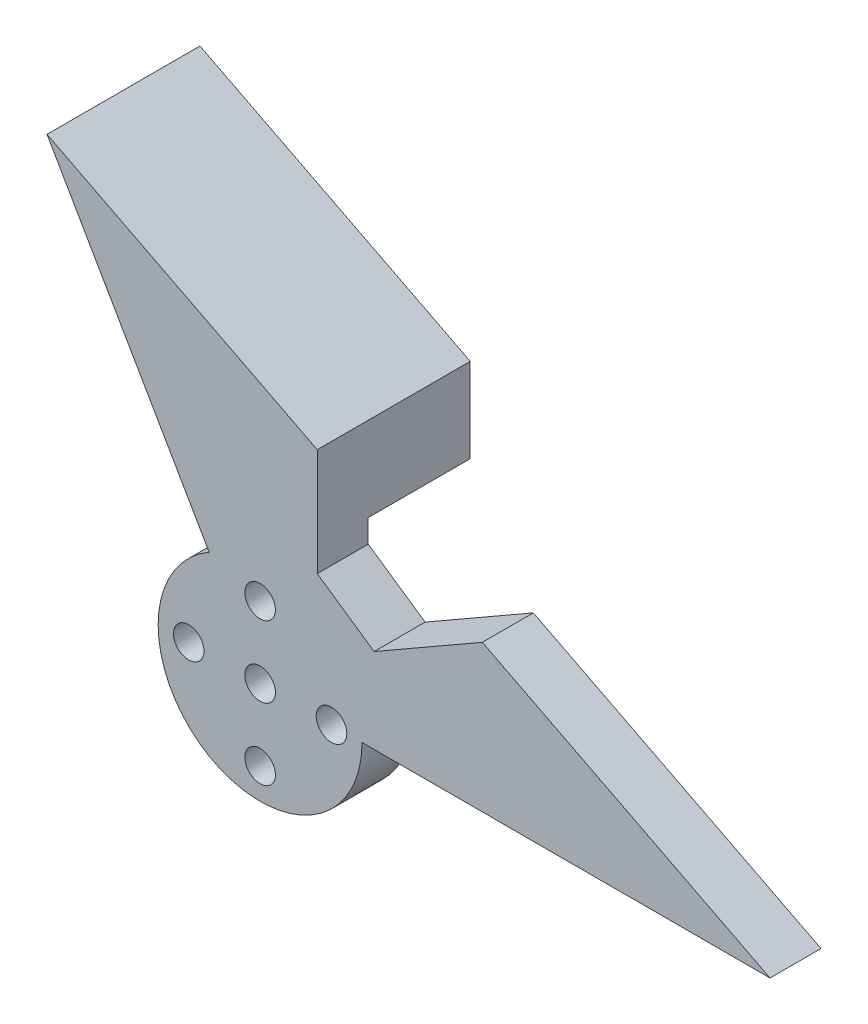
ISO-10303-21;
HEADER;
FILE_DESCRIPTION(('STEP AP214'),'2;1');
FILE_NAME('part.step','',(''),(''),'','','');
FILE_SCHEMA(('AUTOMOTIVE_DESIGN { 1 0 10303 214 1 1 1 1 }'));
ENDSEC;
DATA;
#1=APPLICATION_CONTEXT('core data for automotive mechanical design processes');
#2=APPLICATION_PROTOCOL_DEFINITION('international standard','automotive_design',2000,#1);
#3=PRODUCT_CONTEXT('',#1,'mechanical');
#4=PRODUCT('Part','Part','',(#3));
#5=PRODUCT_RELATED_PRODUCT_CATEGORY('part','',(#4));
#6=PRODUCT_DEFINITION_FORMATION('','',#4);
#7=PRODUCT_DEFINITION_CONTEXT('part definition',#1,'design');
#8=PRODUCT_DEFINITION('design','',#6,#7);
#9=PRODUCT_DEFINITION_SHAPE('','',#8);
#10=(LENGTH_UNIT() NAMED_UNIT(*) SI_UNIT(.MILLI.,.METRE.));
#11=(NAMED_UNIT(*) PLANE_ANGLE_UNIT() SI_UNIT($,.RADIAN.));
#12=(NAMED_UNIT(*) SI_UNIT($,.STERADIAN.) SOLID_ANGLE_UNIT());
#13=UNCERTAINTY_MEASURE_WITH_UNIT(LENGTH_MEASURE(1.E-05),#10,'distance_accuracy_value','');
#14=(GEOMETRIC_REPRESENTATION_CONTEXT(3) GLOBAL_UNCERTAINTY_ASSIGNED_CONTEXT((#13)) GLOBAL_UNIT_ASSIGNED_CONTEXT((#10,
#11,#12)) REPRESENTATION_CONTEXT('',''));
#15=CARTESIAN_POINT('',(0.,0.,0.));
#16=DIRECTION('',(0.,0.,1.));
#17=DIRECTION('',(1.,0.,0.));
#18=AXIS2_PLACEMENT_3D('',#15,#16,#17);
#19=CARTESIAN_POINT('',(0.,0.,0.));
#20=DIRECTION('',(0.,0.,1.));
#21=DIRECTION('',(1.,0.,0.));
#22=AXIS2_PLACEMENT_3D('',#19,#20,#21);
#23=PLANE('',#22);
#24=CARTESIAN_POINT('',(0.,0.,0.));
#25=DIRECTION('',(0.,0.,1.));
#26=DIRECTION('',(1.,0.,0.));
#27=AXIS2_PLACEMENT_3D('',#24,#25,#26);
#28=CIRCLE('',#27,1.5);
#29=CARTESIAN_POINT('',(1.5,0.,0.));
#30=VERTEX_POINT('',#29);
#31=EDGE_CURVE('E426',#30,#30,#28,.T.);
#32=ORIENTED_EDGE('',*,*,#31,.T.);
#33=EDGE_LOOP('',(#32));
#34=FACE_BOUND('',#33,.T.);
#35=CARTESIAN_POINT('',(0.,7.,0.));
#36=DIRECTION('',(0.,0.,1.));
#37=DIRECTION('',(1.,0.,0.));
#38=AXIS2_PLACEMENT_3D('',#35,#36,#37);
#39=CIRCLE('',#38,1.5);
#40=CARTESIAN_POINT('',(1.5,7.,0.));
#41=VERTEX_POINT('',#40);
#42=EDGE_CURVE('E460',#41,#41,#39,.T.);
#43=ORIENTED_EDGE('',*,*,#42,.T.);
#44=EDGE_LOOP('',(#43));
#45=FACE_BOUND('',#44,.T.);
#46=CARTESIAN_POINT('',(7.,0.,0.));
#47=DIRECTION('',(0.,0.,1.));
#48=DIRECTION('',(1.,0.,0.));
#49=AXIS2_PLACEMENT_3D('',#46,#47,#48);
#50=CIRCLE('',#49,1.5);
#51=CARTESIAN_POINT('',(8.5,0.,0.));
#52=VERTEX_POINT('',#51);
#53=EDGE_CURVE('E456',#52,#52,#50,.T.);
#54=ORIENTED_EDGE('',*,*,#53,.T.);
#55=EDGE_LOOP('',(#54));
#56=FACE_BOUND('',#55,.T.);
#57=CARTESIAN_POINT('',(0.,-7.,0.));
#58=DIRECTION('',(0.,0.,1.));
#59=DIRECTION('',(1.,0.,0.));
#60=AXIS2_PLACEMENT_3D('',#57,#58,#59);
#61=CIRCLE('',#60,1.5);
#62=CARTESIAN_POINT('',(1.5,-7.,0.));
#63=VERTEX_POINT('',#62);
#64=EDGE_CURVE('E452',#63,#63,#61,.T.);
#65=ORIENTED_EDGE('',*,*,#64,.T.);
#66=EDGE_LOOP('',(#65));
#67=FACE_BOUND('',#66,.T.);
#68=CARTESIAN_POINT('',(-7.,0.,0.));
#69=DIRECTION('',(0.,0.,1.));
#70=DIRECTION('',(1.,0.,0.));
#71=AXIS2_PLACEMENT_3D('',#68,#69,#70);
#72=CIRCLE('',#71,1.5);
#73=CARTESIAN_POINT('',(-5.5,0.,0.));
#74=VERTEX_POINT('',#73);
#75=EDGE_CURVE('E441',#74,#74,#72,.T.);
#76=ORIENTED_EDGE('',*,*,#75,.T.);
#77=EDGE_LOOP('',(#76));
#78=FACE_BOUND('',#77,.T.);
#79=DIRECTION('',(-0.948423761070831,-0.317005314523684,0.));
#80=VECTOR('',#79,1.);
#81=CARTESIAN_POINT('',(-3.76737876846068,11.2713300921487,0.));
#82=LINE('',#81,#80);
#83=CARTESIAN_POINT('',(5.60315487744621,14.403378325864,0.));
#84=VERTEX_POINT('',#83);
#85=CARTESIAN_POINT('',(-6.06426194190596,10.5036097937875,0.));
#86=VERTEX_POINT('',#85);
#87=EDGE_CURVE('E56',#84,#86,#82,.T.);
#88=ORIENTED_EDGE('',*,*,#87,.F.);
#89=DIRECTION('',(0.,-1.,0.));
#90=VECTOR('',#89,1.);
#91=CARTESIAN_POINT('',(5.60315487744621,25.2923778187747,0.));
#92=LINE('',#91,#90);
#93=CARTESIAN_POINT('',(5.60315487744621,12.1416789813155,0.));
#94=VERTEX_POINT('',#93);
#95=EDGE_CURVE('E142',#84,#94,#92,.T.);
#96=ORIENTED_EDGE('',*,*,#95,.T.);
#97=DIRECTION('',(0.824400775660672,-0.566006502692401,0.));
#98=VECTOR('',#97,1.);
#99=CARTESIAN_POINT('',(5.60315487744621,12.1416789813155,0.));
#100=LINE('',#99,#98);
#101=CARTESIAN_POINT('',(11.1797170426979,8.31299450965011,0.));
#102=VERTEX_POINT('',#101);
#103=EDGE_CURVE('E155',#94,#102,#100,.T.);
#104=ORIENTED_EDGE('',*,*,#103,.T.);
#105=DIRECTION('',(0.867253096834808,0.497867518553315,0.));
#106=VECTOR('',#105,1.);
#107=CARTESIAN_POINT('',(11.1797170426979,8.31299450965011,0.));
#108=LINE('',#107,#106);
#109=CARTESIAN_POINT('',(21.7887727225543,14.403378325864,0.));
#110=VERTEX_POINT('',#109);
#111=EDGE_CURVE('E160',#102,#110,#108,.T.);
#112=ORIENTED_EDGE('',*,*,#111,.T.);
#113=DIRECTION('',(-0.890635372697617,0.454718190640948,0.));
#114=VECTOR('',#113,1.);
#115=CARTESIAN_POINT('',(50.,0.,0.));
#116=LINE('',#115,#114);
#117=CARTESIAN_POINT('',(50.,0.,0.));
#118=VERTEX_POINT('',#117);
#119=EDGE_CURVE('E180',#118,#110,#116,.T.);
#120=ORIENTED_EDGE('',*,*,#119,.F.);
#121=DIRECTION('',(1.,0.,0.));
#122=VECTOR('',#121,1.);
#123=CARTESIAN_POINT('',(0.,0.,0.));
#124=LINE('',#123,#122);
#125=CARTESIAN_POINT('',(10.,0.,0.));
#126=VERTEX_POINT('',#125);
#127=EDGE_CURVE('E177',#126,#118,#124,.T.);
#128=ORIENTED_EDGE('',*,*,#127,.F.);
#129=CARTESIAN_POINT('',(0.,0.,0.));
#130=DIRECTION('',(0.,0.,1.));
#131=DIRECTION('',(1.,0.,0.));
#132=AXIS2_PLACEMENT_3D('',#129,#130,#131);
#133=CIRCLE('',#132,10.);
#134=CARTESIAN_POINT('',(-4.99999999999998,8.6602540378444,0.));
#135=VERTEX_POINT('',#134);
#136=EDGE_CURVE('E212',#135,#126,#133,.T.);
#137=ORIENTED_EDGE('',*,*,#136,.F.);
#138=DIRECTION('',(0.499999999999998,-0.86602540378444,0.));
#139=VECTOR('',#138,1.);
#140=CARTESIAN_POINT('',(-20.8987519536282,36.1977001984636,0.));
#141=LINE('',#140,#139);
#142=EDGE_CURVE('E184',#86,#135,#141,.T.);
#143=ORIENTED_EDGE('',*,*,#142,.F.);
#144=EDGE_LOOP('',(#88,#96,#104,#112,#120,#128,#137,#143));
#145=FACE_BOUND('',#144,.T.);
#146=ADVANCED_FACE('F40',(#34,#45,#56,#67,#78,#145),#23,.F.);
#147=CARTESIAN_POINT('',(50.,0.,0.));
#148=DIRECTION('',(0.454718190640948,0.890635372697617,0.));
#149=DIRECTION('',(-0.890635372697617,0.454718190640948,0.));
#150=AXIS2_PLACEMENT_3D('',#147,#148,#149);
#151=PLANE('',#150);
#152=DIRECTION('',(0.,0.,-1.));
#153=VECTOR('',#152,1.);
#154=CARTESIAN_POINT('',(21.7887727225543,14.403378325864,0.));
#155=LINE('',#154,#153);
#156=CARTESIAN_POINT('',(21.7887727225543,14.403378325864,5.));
#157=VERTEX_POINT('',#156);
#158=EDGE_CURVE('E11',#157,#110,#155,.T.);
#159=ORIENTED_EDGE('',*,*,#158,.F.);
#160=DIRECTION('',(-0.890635372697617,0.454718190640948,0.));
#161=VECTOR('',#160,1.);
#162=CARTESIAN_POINT('',(50.,0.,5.));
#163=LINE('',#162,#161);
#164=CARTESIAN_POINT('',(50.,0.,5.));
#165=VERTEX_POINT('',#164);
#166=EDGE_CURVE('E191',#165,#157,#163,.T.);
#167=ORIENTED_EDGE('',*,*,#166,.F.);
#168=DIRECTION('',(0.,0.,1.));
#169=VECTOR('',#168,1.);
#170=CARTESIAN_POINT('',(50.,0.,0.));
#171=LINE('',#170,#169);
#172=EDGE_CURVE('E187',#118,#165,#171,.T.);
#173=ORIENTED_EDGE('',*,*,#172,.F.);
#174=ORIENTED_EDGE('',*,*,#119,.T.);
#175=EDGE_LOOP('',(#159,#167,#173,#174));
#176=FACE_BOUND('',#175,.T.);
#177=ADVANCED_FACE('F240',(#176),#151,.T.);
#178=CARTESIAN_POINT('',(0.,0.,5.));
#179=DIRECTION('',(0.,0.,-1.));
#180=DIRECTION('',(-1.,0.,0.));
#181=AXIS2_PLACEMENT_3D('',#178,#179,#180);
#182=CYLINDRICAL_SURFACE('',#181,10.);
#183=CARTESIAN_POINT('',(0.,0.,5.));
#184=DIRECTION('',(0.,0.,1.));
#185=DIRECTION('',(1.,0.,0.));
#186=AXIS2_PLACEMENT_3D('',#183,#184,#185);
#187=CIRCLE('',#186,10.);
#188=CARTESIAN_POINT('',(-4.99999999999998,8.6602540378444,5.));
#189=VERTEX_POINT('',#188);
#190=CARTESIAN_POINT('',(10.,0.,5.));
#191=VERTEX_POINT('',#190);
#192=EDGE_CURVE('E213',#189,#191,#187,.T.);
#193=ORIENTED_EDGE('',*,*,#192,.F.);
#194=DIRECTION('',(0.,0.,-1.));
#195=VECTOR('',#194,1.);
#196=CARTESIAN_POINT('',(-4.99999999999998,8.6602540378444,5.));
#197=LINE('',#196,#195);
#198=EDGE_CURVE('E208',#189,#135,#197,.T.);
#199=ORIENTED_EDGE('',*,*,#198,.T.);
#200=ORIENTED_EDGE('',*,*,#136,.T.);
#201=DIRECTION('',(0.,0.,-1.));
#202=VECTOR('',#201,1.);
#203=CARTESIAN_POINT('',(10.,0.,5.));
#204=LINE('',#203,#202);
#205=EDGE_CURVE('E201',#126,#191,#204,.F.);
#206=ORIENTED_EDGE('',*,*,#205,.T.);
#207=EDGE_LOOP('',(#193,#199,#200,#206));
#208=FACE_BOUND('',#207,.T.);
#209=ADVANCED_FACE('F42',(#208),#182,.T.);
#210=CARTESIAN_POINT('',(0.,0.,5.));
#211=DIRECTION('',(0.,0.,1.));
#212=DIRECTION('',(1.,0.,0.));
#213=AXIS2_PLACEMENT_3D('',#210,#211,#212);
#214=PLANE('',#213);
#215=CARTESIAN_POINT('',(0.,0.,5.));
#216=DIRECTION('',(0.,0.,1.));
#217=DIRECTION('',(1.,0.,0.));
#218=AXIS2_PLACEMENT_3D('',#215,#216,#217);
#219=CIRCLE('',#218,1.5);
#220=CARTESIAN_POINT('',(1.5,0.,5.));
#221=VERTEX_POINT('',#220);
#222=EDGE_CURVE('E424',#221,#221,#219,.T.);
#223=ORIENTED_EDGE('',*,*,#222,.F.);
#224=EDGE_LOOP('',(#223));
#225=FACE_BOUND('',#224,.T.);
#226=CARTESIAN_POINT('',(0.,7.,5.));
#227=DIRECTION('',(0.,0.,1.));
#228=DIRECTION('',(1.,0.,0.));
#229=AXIS2_PLACEMENT_3D('',#226,#227,#228);
#230=CIRCLE('',#229,1.5);
#231=CARTESIAN_POINT('',(1.5,7.,5.));
#232=VERTEX_POINT('',#231);
#233=EDGE_CURVE('E437',#232,#232,#230,.T.);
#234=ORIENTED_EDGE('',*,*,#233,.F.);
#235=EDGE_LOOP('',(#234));
#236=FACE_BOUND('',#235,.T.);
#237=CARTESIAN_POINT('',(7.,0.,5.));
#238=DIRECTION('',(0.,0.,1.));
#239=DIRECTION('',(1.,0.,0.));
#240=AXIS2_PLACEMENT_3D('',#237,#238,#239);
#241=CIRCLE('',#240,1.5);
#242=CARTESIAN_POINT('',(8.5,0.,5.));
#243=VERTEX_POINT('',#242);
#244=EDGE_CURVE('E442',#243,#243,#241,.T.);
#245=ORIENTED_EDGE('',*,*,#244,.F.);
#246=EDGE_LOOP('',(#245));
#247=FACE_BOUND('',#246,.T.);
#248=CARTESIAN_POINT('',(0.,-7.,5.));
#249=DIRECTION('',(0.,0.,1.));
#250=DIRECTION('',(1.,0.,0.));
#251=AXIS2_PLACEMENT_3D('',#248,#249,#250);
#252=CIRCLE('',#251,1.5);
#253=CARTESIAN_POINT('',(1.5,-7.,5.));
#254=VERTEX_POINT('',#253);
#255=EDGE_CURVE('E433',#254,#254,#252,.T.);
#256=ORIENTED_EDGE('',*,*,#255,.F.);
#257=EDGE_LOOP('',(#256));
#258=FACE_BOUND('',#257,.T.);
#259=CARTESIAN_POINT('',(-7.,0.,5.));
#260=DIRECTION('',(0.,0.,1.));
#261=DIRECTION('',(1.,0.,0.));
#262=AXIS2_PLACEMENT_3D('',#259,#260,#261);
#263=CIRCLE('',#262,1.5);
#264=CARTESIAN_POINT('',(-5.5,0.,5.));
#265=VERTEX_POINT('',#264);
#266=EDGE_CURVE('E428',#265,#265,#263,.T.);
#267=ORIENTED_EDGE('',*,*,#266,.F.);
#268=EDGE_LOOP('',(#267));
#269=FACE_BOUND('',#268,.T.);
#270=DIRECTION('',(0.867253096834808,0.497867518553315,0.));
#271=VECTOR('',#270,1.);
#272=CARTESIAN_POINT('',(11.1797170426979,8.31299450965011,5.));
#273=LINE('',#272,#271);
#274=CARTESIAN_POINT('',(11.1797170426979,8.31299450965011,5.));
#275=VERTEX_POINT('',#274);
#276=EDGE_CURVE('E156',#275,#157,#273,.T.);
#277=ORIENTED_EDGE('',*,*,#276,.F.);
#278=DIRECTION('',(0.824400775660672,-0.566006502692401,0.));
#279=VECTOR('',#278,1.);
#280=CARTESIAN_POINT('',(5.60315487744621,12.1416789813155,5.));
#281=LINE('',#280,#279);
#282=CARTESIAN_POINT('',(5.60315487744621,12.1416789813155,5.));
#283=VERTEX_POINT('',#282);
#284=EDGE_CURVE('E148',#283,#275,#281,.T.);
#285=ORIENTED_EDGE('',*,*,#284,.F.);
#286=DIRECTION('',(0.,-1.,0.));
#287=VECTOR('',#286,1.);
#288=CARTESIAN_POINT('',(5.60315487744621,25.2923778187747,5.));
#289=LINE('',#288,#287);
#290=CARTESIAN_POINT('',(5.60315487744621,22.6670236812481,5.));
#291=VERTEX_POINT('',#290);
#292=EDGE_CURVE('E144',#291,#283,#289,.T.);
#293=ORIENTED_EDGE('',*,*,#292,.F.);
#294=CARTESIAN_POINT('',(-20.8987519536282,36.1977001984636,5.));
#295=VERTEX_POINT('',#294);
#296=EDGE_CURVE('E190',#291,#295,#163,.T.);
#297=ORIENTED_EDGE('',*,*,#296,.T.);
#298=DIRECTION('',(0.499999999999998,-0.86602540378444,0.));
#299=VECTOR('',#298,1.);
#300=CARTESIAN_POINT('',(-20.8987519536282,36.1977001984636,5.));
#301=LINE('',#300,#299);
#302=EDGE_CURVE('E64',#295,#189,#301,.T.);
#303=ORIENTED_EDGE('',*,*,#302,.T.);
#304=ORIENTED_EDGE('',*,*,#192,.T.);
#305=DIRECTION('',(1.,0.,0.));
#306=VECTOR('',#305,1.);
#307=CARTESIAN_POINT('',(10.,0.,5.));
#308=LINE('',#307,#306);
#309=EDGE_CURVE('E173',#191,#165,#308,.T.);
#310=ORIENTED_EDGE('',*,*,#309,.T.);
#311=ORIENTED_EDGE('',*,*,#166,.T.);
#312=EDGE_LOOP('',(#277,#285,#293,#297,#303,#304,#310,#311));
#313=FACE_BOUND('',#312,.T.);
#314=ADVANCED_FACE('F224',(#225,#236,#247,#258,#269,#313),#214,.T.);
#315=CARTESIAN_POINT('',(-20.8987519536282,36.1977001984636,0.));
#316=DIRECTION('',(-0.86602540378444,-0.499999999999998,0.));
#317=DIRECTION('',(0.499999999999998,-0.86602540378444,0.));
#318=AXIS2_PLACEMENT_3D('',#315,#316,#317);
#319=PLANE('',#318);
#320=ORIENTED_EDGE('',*,*,#198,.F.);
#321=ORIENTED_EDGE('',*,*,#302,.F.);
#322=DIRECTION('',(0.,0.,1.));
#323=VECTOR('',#322,1.);
#324=CARTESIAN_POINT('',(-20.8987519536282,36.1977001984636,0.));
#325=LINE('',#324,#323);
#326=CARTESIAN_POINT('',(-20.8987519536282,36.1977001984636,-10.));
#327=VERTEX_POINT('',#326);
#328=EDGE_CURVE('E197',#327,#295,#325,.T.);
#329=ORIENTED_EDGE('',*,*,#328,.F.);
#330=DIRECTION('',(-0.499999999999998,0.86602540378444,0.));
#331=VECTOR('',#330,1.);
#332=CARTESIAN_POINT('',(0.,0.,-10.));
#333=LINE('',#332,#331);
#334=CARTESIAN_POINT('',(-6.06426194190596,10.5036097937875,-10.));
#335=VERTEX_POINT('',#334);
#336=EDGE_CURVE('E129',#335,#327,#333,.T.);
#337=ORIENTED_EDGE('',*,*,#336,.F.);
#338=DIRECTION('',(0.,0.,1.));
#339=VECTOR('',#338,1.);
#340=CARTESIAN_POINT('',(-6.06426194190596,10.5036097937875,-10.));
#341=LINE('',#340,#339);
#342=EDGE_CURVE('E124',#335,#86,#341,.T.);
#343=ORIENTED_EDGE('',*,*,#342,.T.);
#344=ORIENTED_EDGE('',*,*,#142,.T.);
#345=EDGE_LOOP('',(#320,#321,#329,#337,#343,#344));
#346=FACE_BOUND('',#345,.T.);
#347=ADVANCED_FACE('F228',(#346),#319,.T.);
#348=CARTESIAN_POINT('',(10.,0.,0.));
#349=DIRECTION('',(0.,-1.,0.));
#350=DIRECTION('',(0.,0.,-1.));
#351=AXIS2_PLACEMENT_3D('',#348,#349,#350);
#352=PLANE('',#351);
#353=ORIENTED_EDGE('',*,*,#205,.F.);
#354=ORIENTED_EDGE('',*,*,#127,.T.);
#355=ORIENTED_EDGE('',*,*,#172,.T.);
#356=ORIENTED_EDGE('',*,*,#309,.F.);
#357=EDGE_LOOP('',(#353,#354,#355,#356));
#358=FACE_BOUND('',#357,.T.);
#359=ADVANCED_FACE('F235',(#358),#352,.T.);
#360=DIRECTION('',(0.,0.,1.));
#361=VECTOR('',#360,1.);
#362=CARTESIAN_POINT('',(5.60315487744621,22.667023681248,0.));
#363=LINE('',#362,#361);
#364=CARTESIAN_POINT('',(5.60315487744621,22.667023681248,-10.));
#365=VERTEX_POINT('',#364);
#366=EDGE_CURVE('E49',#365,#291,#363,.T.);
#367=ORIENTED_EDGE('',*,*,#366,.F.);
#368=DIRECTION('',(0.890635372697617,-0.454718190640948,0.));
#369=VECTOR('',#368,1.);
#370=CARTESIAN_POINT('',(10.3384316449889,20.2494052596943,-10.));
#371=LINE('',#370,#369);
#372=EDGE_CURVE('E136',#327,#365,#371,.T.);
#373=ORIENTED_EDGE('',*,*,#372,.F.);
#374=ORIENTED_EDGE('',*,*,#328,.T.);
#375=ORIENTED_EDGE('',*,*,#296,.F.);
#376=EDGE_LOOP('',(#367,#373,#374,#375));
#377=FACE_BOUND('',#376,.T.);
#378=ADVANCED_FACE('F225',(#377),#151,.T.);
#379=CARTESIAN_POINT('',(11.1797170426979,8.31299450965011,0.));
#380=DIRECTION('',(0.497867518553315,-0.867253096834808,0.));
#381=DIRECTION('',(0.867253096834808,0.497867518553315,0.));
#382=AXIS2_PLACEMENT_3D('',#379,#380,#381);
#383=PLANE('',#382);
#384=ORIENTED_EDGE('',*,*,#158,.T.);
#385=ORIENTED_EDGE('',*,*,#111,.F.);
#386=DIRECTION('',(0.,0.,1.));
#387=VECTOR('',#386,1.);
#388=CARTESIAN_POINT('',(11.1797170426979,8.31299450965011,0.));
#389=LINE('',#388,#387);
#390=EDGE_CURVE('E170',#102,#275,#389,.T.);
#391=ORIENTED_EDGE('',*,*,#390,.T.);
#392=ORIENTED_EDGE('',*,*,#276,.T.);
#393=EDGE_LOOP('',(#384,#385,#391,#392));
#394=FACE_BOUND('',#393,.T.);
#395=ADVANCED_FACE('F243',(#394),#383,.F.);
#396=CARTESIAN_POINT('',(5.60315487744621,12.1416789813155,0.));
#397=DIRECTION('',(-0.566006502692401,-0.824400775660671,0.));
#398=DIRECTION('',(0.824400775660671,-0.566006502692401,0.));
#399=AXIS2_PLACEMENT_3D('',#396,#397,#398);
#400=PLANE('',#399);
#401=ORIENTED_EDGE('',*,*,#284,.T.);
#402=ORIENTED_EDGE('',*,*,#390,.F.);
#403=ORIENTED_EDGE('',*,*,#103,.F.);
#404=DIRECTION('',(0.,0.,1.));
#405=VECTOR('',#404,1.);
#406=CARTESIAN_POINT('',(5.60315487744621,12.1416789813155,0.));
#407=LINE('',#406,#405);
#408=EDGE_CURVE('E163',#94,#283,#407,.T.);
#409=ORIENTED_EDGE('',*,*,#408,.T.);
#410=EDGE_LOOP('',(#401,#402,#403,#409));
#411=FACE_BOUND('',#410,.T.);
#412=ADVANCED_FACE('F246',(#411),#400,.F.);
#413=CARTESIAN_POINT('',(5.60315487744621,25.2923778187747,0.));
#414=DIRECTION('',(-1.,0.,0.));
#415=DIRECTION('',(0.,0.,1.));
#416=AXIS2_PLACEMENT_3D('',#413,#414,#415);
#417=PLANE('',#416);
#418=ORIENTED_EDGE('',*,*,#366,.T.);
#419=ORIENTED_EDGE('',*,*,#292,.T.);
#420=ORIENTED_EDGE('',*,*,#408,.F.);
#421=ORIENTED_EDGE('',*,*,#95,.F.);
#422=DIRECTION('',(0.,0.,1.));
#423=VECTOR('',#422,1.);
#424=CARTESIAN_POINT('',(5.60315487744621,14.403378325864,-10.));
#425=LINE('',#424,#423);
#426=CARTESIAN_POINT('',(5.60315487744621,14.403378325864,-10.));
#427=VERTEX_POINT('',#426);
#428=EDGE_CURVE('E122',#427,#84,#425,.T.);
#429=ORIENTED_EDGE('',*,*,#428,.F.);
#430=DIRECTION('',(0.,-1.,0.));
#431=VECTOR('',#430,1.);
#432=CARTESIAN_POINT('',(5.60315487744621,0.,-10.));
#433=LINE('',#432,#431);
#434=EDGE_CURVE('E130',#365,#427,#433,.T.);
#435=ORIENTED_EDGE('',*,*,#434,.F.);
#436=EDGE_LOOP('',(#418,#419,#420,#421,#429,#435));
#437=FACE_BOUND('',#436,.T.);
#438=ADVANCED_FACE('F140',(#437),#417,.F.);
#439=CARTESIAN_POINT('',(-3.76737876846068,11.2713300921487,-10.));
#440=DIRECTION('',(-0.317005314523684,0.948423761070831,0.));
#441=DIRECTION('',(-0.948423761070831,-0.317005314523684,0.));
#442=AXIS2_PLACEMENT_3D('',#439,#440,#441);
#443=PLANE('',#442);
#444=ORIENTED_EDGE('',*,*,#87,.T.);
#445=ORIENTED_EDGE('',*,*,#342,.F.);
#446=DIRECTION('',(-0.948423761070831,-0.317005314523684,0.));
#447=VECTOR('',#446,1.);
#448=CARTESIAN_POINT('',(-3.76737876846068,11.2713300921487,-10.));
#449=LINE('',#448,#447);
#450=EDGE_CURVE('E118',#427,#335,#449,.T.);
#451=ORIENTED_EDGE('',*,*,#450,.F.);
#452=ORIENTED_EDGE('',*,*,#428,.T.);
#453=EDGE_LOOP('',(#444,#445,#451,#452));
#454=FACE_BOUND('',#453,.T.);
#455=ADVANCED_FACE('F120',(#454),#443,.F.);
#456=CARTESIAN_POINT('',(0.,0.,-10.));
#457=DIRECTION('',(0.,0.,-1.));
#458=DIRECTION('',(-1.,0.,0.));
#459=AXIS2_PLACEMENT_3D('',#456,#457,#458);
#460=PLANE('',#459);
#461=ORIENTED_EDGE('',*,*,#434,.T.);
#462=ORIENTED_EDGE('',*,*,#450,.T.);
#463=ORIENTED_EDGE('',*,*,#336,.T.);
#464=ORIENTED_EDGE('',*,*,#372,.T.);
#465=EDGE_LOOP('',(#461,#462,#463,#464));
#466=FACE_BOUND('',#465,.T.);
#467=ADVANCED_FACE('F134',(#466),#460,.T.);
#468=CARTESIAN_POINT('',(-7.,0.,-5.));
#469=DIRECTION('',(0.,0.,1.));
#470=DIRECTION('',(1.,0.,0.));
#471=AXIS2_PLACEMENT_3D('',#468,#469,#470);
#472=CYLINDRICAL_SURFACE('',#471,1.5);
#473=ORIENTED_EDGE('',*,*,#266,.T.);
#474=EDGE_LOOP('',(#473));
#475=FACE_BOUND('',#474,.T.);
#476=ORIENTED_EDGE('',*,*,#75,.F.);
#477=EDGE_LOOP('',(#476));
#478=FACE_BOUND('',#477,.T.);
#479=ADVANCED_FACE('F367',(#475,#478),#472,.F.);
#480=CARTESIAN_POINT('',(0.,-7.,-5.));
#481=DIRECTION('',(0.,0.,1.));
#482=DIRECTION('',(1.,0.,0.));
#483=AXIS2_PLACEMENT_3D('',#480,#481,#482);
#484=CYLINDRICAL_SURFACE('',#483,1.5);
#485=ORIENTED_EDGE('',*,*,#255,.T.);
#486=EDGE_LOOP('',(#485));
#487=FACE_BOUND('',#486,.T.);
#488=ORIENTED_EDGE('',*,*,#64,.F.);
#489=EDGE_LOOP('',(#488));
#490=FACE_BOUND('',#489,.T.);
#491=ADVANCED_FACE('F375',(#487,#490),#484,.F.);
#492=CARTESIAN_POINT('',(7.,0.,-5.));
#493=DIRECTION('',(0.,0.,1.));
#494=DIRECTION('',(1.,0.,0.));
#495=AXIS2_PLACEMENT_3D('',#492,#493,#494);
#496=CYLINDRICAL_SURFACE('',#495,1.5);
#497=ORIENTED_EDGE('',*,*,#244,.T.);
#498=EDGE_LOOP('',(#497));
#499=FACE_BOUND('',#498,.T.);
#500=ORIENTED_EDGE('',*,*,#53,.F.);
#501=EDGE_LOOP('',(#500));
#502=FACE_BOUND('',#501,.T.);
#503=ADVANCED_FACE('F384',(#499,#502),#496,.F.);
#504=CARTESIAN_POINT('',(0.,7.,-5.));
#505=DIRECTION('',(0.,0.,1.));
#506=DIRECTION('',(1.,0.,0.));
#507=AXIS2_PLACEMENT_3D('',#504,#505,#506);
#508=CYLINDRICAL_SURFACE('',#507,1.5);
#509=ORIENTED_EDGE('',*,*,#233,.T.);
#510=EDGE_LOOP('',(#509));
#511=FACE_BOUND('',#510,.T.);
#512=ORIENTED_EDGE('',*,*,#42,.F.);
#513=EDGE_LOOP('',(#512));
#514=FACE_BOUND('',#513,.T.);
#515=ADVANCED_FACE('F393',(#511,#514),#508,.F.);
#516=CARTESIAN_POINT('',(0.,0.,-5.));
#517=DIRECTION('',(0.,0.,1.));
#518=DIRECTION('',(1.,0.,0.));
#519=AXIS2_PLACEMENT_3D('',#516,#517,#518);
#520=CYLINDRICAL_SURFACE('',#519,1.5);
#521=ORIENTED_EDGE('',*,*,#222,.T.);
#522=EDGE_LOOP('',(#521));
#523=FACE_BOUND('',#522,.T.);
#524=ORIENTED_EDGE('',*,*,#31,.F.);
#525=EDGE_LOOP('',(#524));
#526=FACE_BOUND('',#525,.T.);
#527=ADVANCED_FACE('F401',(#523,#526),#520,.F.);
#528=CLOSED_SHELL('',(#146,#177,#209,#314,#347,#359,#378,#395,#412,#438,#455,#467,#479,#491,
#503,#515,#527));
#529=MANIFOLD_SOLID_BREP('B2',#528);
#530=ADVANCED_BREP_SHAPE_REPRESENTATION('',(#18,#529),#14);
#531=SHAPE_DEFINITION_REPRESENTATION(#9,#530);
ENDSEC;
END-ISO-10303-21;
